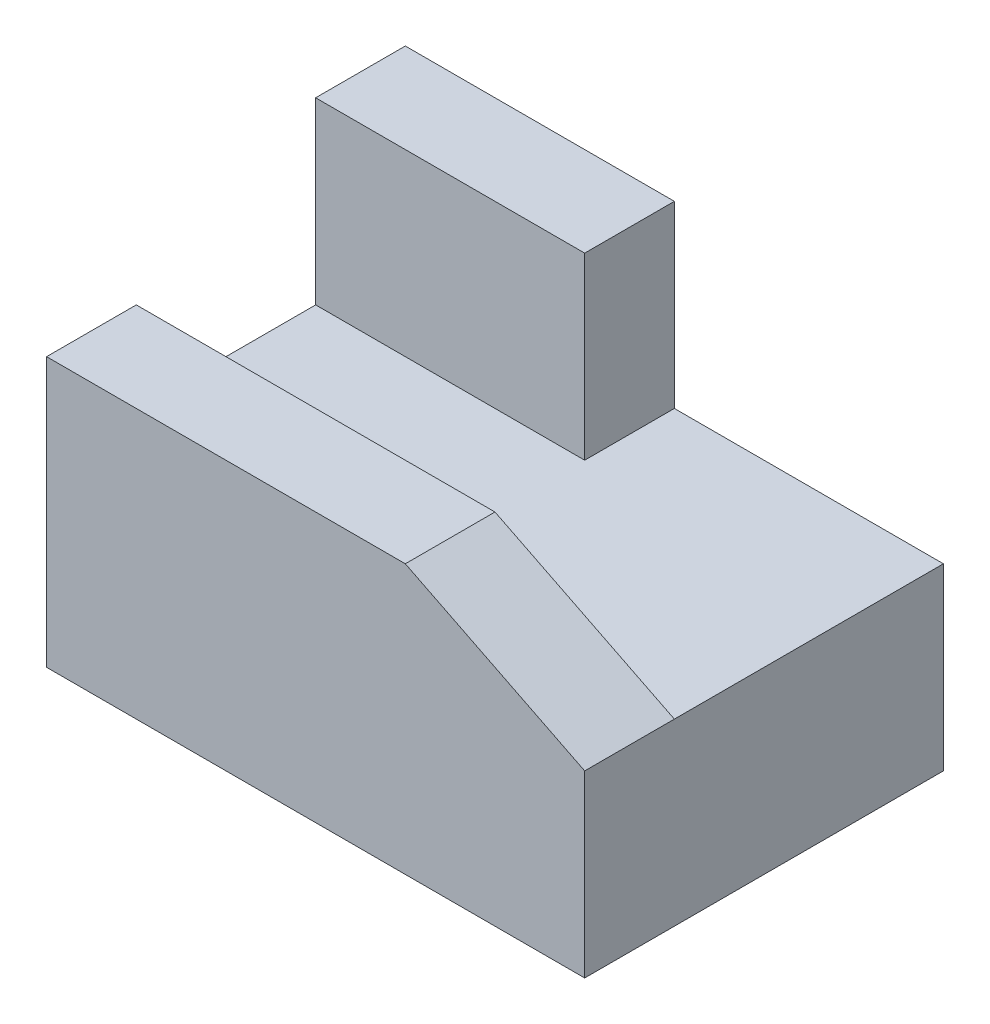
ISO-10303-21;
HEADER;
FILE_DESCRIPTION(('STEP AP214'),'2;1');
FILE_NAME('part.step','',(''),(''),'','','');
FILE_SCHEMA(('AUTOMOTIVE_DESIGN { 1 0 10303 214 1 1 1 1 }'));
ENDSEC;
DATA;
#1=APPLICATION_CONTEXT('core data for automotive mechanical design processes');
#2=APPLICATION_PROTOCOL_DEFINITION('international standard','automotive_design',2000,#1);
#3=PRODUCT_CONTEXT('',#1,'mechanical');
#4=PRODUCT('Part','Part','',(#3));
#5=PRODUCT_RELATED_PRODUCT_CATEGORY('part','',(#4));
#6=PRODUCT_DEFINITION_FORMATION('','',#4);
#7=PRODUCT_DEFINITION_CONTEXT('part definition',#1,'design');
#8=PRODUCT_DEFINITION('design','',#6,#7);
#9=PRODUCT_DEFINITION_SHAPE('','',#8);
#10=(LENGTH_UNIT() NAMED_UNIT(*) SI_UNIT(.MILLI.,.METRE.));
#11=(NAMED_UNIT(*) PLANE_ANGLE_UNIT() SI_UNIT($,.RADIAN.));
#12=(NAMED_UNIT(*) SI_UNIT($,.STERADIAN.) SOLID_ANGLE_UNIT());
#13=UNCERTAINTY_MEASURE_WITH_UNIT(LENGTH_MEASURE(1.E-05),#10,'distance_accuracy_value','');
#14=(GEOMETRIC_REPRESENTATION_CONTEXT(3) GLOBAL_UNCERTAINTY_ASSIGNED_CONTEXT((#13)) GLOBAL_UNIT_ASSIGNED_CONTEXT((#10,
#11,#12)) REPRESENTATION_CONTEXT('',''));
#15=CARTESIAN_POINT('',(0.,0.,0.));
#16=DIRECTION('',(0.,0.,1.));
#17=DIRECTION('',(1.,0.,0.));
#18=AXIS2_PLACEMENT_3D('',#15,#16,#17);
#19=CARTESIAN_POINT('',(0.,0.,40.));
#20=DIRECTION('',(-1.,0.,0.));
#21=DIRECTION('',(0.,-1.,0.));
#22=AXIS2_PLACEMENT_3D('',#19,#20,#21);
#23=PLANE('',#22);
#24=DIRECTION('',(0.,0.,-1.));
#25=VECTOR('',#24,1.);
#26=CARTESIAN_POINT('',(0.,-20.,193.077640640442));
#27=LINE('',#26,#25);
#28=CARTESIAN_POINT('',(0.,-20.,40.));
#29=VERTEX_POINT('',#28);
#30=CARTESIAN_POINT('',(0.,-20.,30.));
#31=VERTEX_POINT('',#30);
#32=EDGE_CURVE('E154',#29,#31,#27,.T.);
#33=ORIENTED_EDGE('',*,*,#32,.F.);
#34=DIRECTION('',(0.,1.,0.));
#35=VECTOR('',#34,1.);
#36=CARTESIAN_POINT('',(0.,0.,40.));
#37=LINE('',#36,#35);
#38=CARTESIAN_POINT('',(0.,-40.,40.));
#39=VERTEX_POINT('',#38);
#40=EDGE_CURVE('E81',#39,#29,#37,.T.);
#41=ORIENTED_EDGE('',*,*,#40,.F.);
#42=DIRECTION('',(0.,0.,-1.));
#43=VECTOR('',#42,1.);
#44=CARTESIAN_POINT('',(0.,-40.,40.));
#45=LINE('',#44,#43);
#46=CARTESIAN_POINT('',(0.,-40.,0.));
#47=VERTEX_POINT('',#46);
#48=EDGE_CURVE('E74',#39,#47,#45,.T.);
#49=ORIENTED_EDGE('',*,*,#48,.T.);
#50=DIRECTION('',(0.,1.,0.));
#51=VECTOR('',#50,1.);
#52=CARTESIAN_POINT('',(0.,0.,0.));
#53=LINE('',#52,#51);
#54=CARTESIAN_POINT('',(0.,-20.,0.));
#55=VERTEX_POINT('',#54);
#56=EDGE_CURVE('E89',#47,#55,#53,.T.);
#57=ORIENTED_EDGE('',*,*,#56,.T.);
#58=DIRECTION('',(0.,0.,-1.));
#59=VECTOR('',#58,1.);
#60=CARTESIAN_POINT('',(0.,-20.,30.));
#61=LINE('',#60,#59);
#62=EDGE_CURVE('E130',#31,#55,#61,.T.);
#63=ORIENTED_EDGE('',*,*,#62,.F.);
#64=EDGE_LOOP('',(#33,#41,#49,#57,#63));
#65=FACE_BOUND('',#64,.T.);
#66=ADVANCED_FACE('F33',(#65),#23,.F.);
#67=CARTESIAN_POINT('',(0.,0.,40.));
#68=DIRECTION('',(0.,-1.,0.));
#69=DIRECTION('',(0.,0.,-1.));
#70=AXIS2_PLACEMENT_3D('',#67,#68,#69);
#71=PLANE('',#70);
#72=DIRECTION('',(0.,0.,-1.));
#73=VECTOR('',#72,1.);
#74=CARTESIAN_POINT('',(-60.,0.,40.));
#75=LINE('',#74,#73);
#76=CARTESIAN_POINT('',(-60.,0.,10.));
#77=VERTEX_POINT('',#76);
#78=CARTESIAN_POINT('',(-60.,0.,0.));
#79=VERTEX_POINT('',#78);
#80=EDGE_CURVE('E109',#77,#79,#75,.T.);
#81=ORIENTED_EDGE('',*,*,#80,.F.);
#82=DIRECTION('',(-1.,0.,0.));
#83=VECTOR('',#82,1.);
#84=CARTESIAN_POINT('',(-30.,0.,10.));
#85=LINE('',#84,#83);
#86=CARTESIAN_POINT('',(-30.,0.,10.));
#87=VERTEX_POINT('',#86);
#88=EDGE_CURVE('E131',#87,#77,#85,.T.);
#89=ORIENTED_EDGE('',*,*,#88,.F.);
#90=DIRECTION('',(0.,0.,-1.));
#91=VECTOR('',#90,1.);
#92=CARTESIAN_POINT('',(-30.,0.,193.077640640442));
#93=LINE('',#92,#91);
#94=CARTESIAN_POINT('',(-30.,0.,0.));
#95=VERTEX_POINT('',#94);
#96=EDGE_CURVE('E157',#87,#95,#93,.T.);
#97=ORIENTED_EDGE('',*,*,#96,.T.);
#98=DIRECTION('',(-1.,0.,0.));
#99=VECTOR('',#98,1.);
#100=CARTESIAN_POINT('',(0.,0.,0.));
#101=LINE('',#100,#99);
#102=EDGE_CURVE('E96',#95,#79,#101,.T.);
#103=ORIENTED_EDGE('',*,*,#102,.T.);
#104=EDGE_LOOP('',(#81,#89,#97,#103));
#105=FACE_BOUND('',#104,.T.);
#106=ADVANCED_FACE('F179',(#105),#71,.F.);
#107=CARTESIAN_POINT('',(0.,0.,40.));
#108=DIRECTION('',(0.,0.,-1.));
#109=DIRECTION('',(-1.,0.,0.));
#110=AXIS2_PLACEMENT_3D('',#107,#108,#109);
#111=PLANE('',#110);
#112=DIRECTION('',(1.,0.,0.));
#113=VECTOR('',#112,1.);
#114=CARTESIAN_POINT('',(0.,-9.99999999999999,40.));
#115=LINE('',#114,#113);
#116=CARTESIAN_POINT('',(-60.,-10.,40.));
#117=VERTEX_POINT('',#116);
#118=CARTESIAN_POINT('',(-20.,-10.,40.));
#119=VERTEX_POINT('',#118);
#120=EDGE_CURVE('E97',#117,#119,#115,.T.);
#121=ORIENTED_EDGE('',*,*,#120,.F.);
#122=DIRECTION('',(0.,-1.,0.));
#123=VECTOR('',#122,1.);
#124=CARTESIAN_POINT('',(-60.,0.,40.));
#125=LINE('',#124,#123);
#126=CARTESIAN_POINT('',(-60.,-40.,40.));
#127=VERTEX_POINT('',#126);
#128=EDGE_CURVE('E164',#117,#127,#125,.T.);
#129=ORIENTED_EDGE('',*,*,#128,.T.);
#130=DIRECTION('',(1.,0.,0.));
#131=VECTOR('',#130,1.);
#132=CARTESIAN_POINT('',(0.,-40.,40.));
#133=LINE('',#132,#131);
#134=EDGE_CURVE('E55',#127,#39,#133,.T.);
#135=ORIENTED_EDGE('',*,*,#134,.T.);
#136=ORIENTED_EDGE('',*,*,#40,.T.);
#137=DIRECTION('',(0.894427190999916,-0.447213595499958,0.));
#138=VECTOR('',#137,1.);
#139=CARTESIAN_POINT('',(-8.00000000000001,-16.,40.));
#140=LINE('',#139,#138);
#141=EDGE_CURVE('E102',#119,#29,#140,.T.);
#142=ORIENTED_EDGE('',*,*,#141,.F.);
#143=EDGE_LOOP('',(#121,#129,#135,#136,#142));
#144=FACE_BOUND('',#143,.T.);
#145=ADVANCED_FACE('F167',(#144),#111,.F.);
#146=CARTESIAN_POINT('',(0.,0.,0.));
#147=DIRECTION('',(0.,0.,-1.));
#148=DIRECTION('',(-1.,0.,0.));
#149=AXIS2_PLACEMENT_3D('',#146,#147,#148);
#150=PLANE('',#149);
#151=DIRECTION('',(0.,-1.,0.));
#152=VECTOR('',#151,1.);
#153=CARTESIAN_POINT('',(-30.,0.,0.));
#154=LINE('',#153,#152);
#155=CARTESIAN_POINT('',(-30.,-20.,0.));
#156=VERTEX_POINT('',#155);
#157=EDGE_CURVE('E40',#95,#156,#154,.T.);
#158=ORIENTED_EDGE('',*,*,#157,.T.);
#159=DIRECTION('',(-1.,0.,0.));
#160=VECTOR('',#159,1.);
#161=CARTESIAN_POINT('',(0.,-20.,0.));
#162=LINE('',#161,#160);
#163=EDGE_CURVE('E95',#55,#156,#162,.T.);
#164=ORIENTED_EDGE('',*,*,#163,.F.);
#165=ORIENTED_EDGE('',*,*,#56,.F.);
#166=DIRECTION('',(1.,0.,0.));
#167=VECTOR('',#166,1.);
#168=CARTESIAN_POINT('',(0.,-40.,0.));
#169=LINE('',#168,#167);
#170=CARTESIAN_POINT('',(-60.,-40.,0.));
#171=VERTEX_POINT('',#170);
#172=EDGE_CURVE('E71',#171,#47,#169,.T.);
#173=ORIENTED_EDGE('',*,*,#172,.F.);
#174=DIRECTION('',(0.,-1.,0.));
#175=VECTOR('',#174,1.);
#176=CARTESIAN_POINT('',(-60.,0.,0.));
#177=LINE('',#176,#175);
#178=EDGE_CURVE('E82',#79,#171,#177,.T.);
#179=ORIENTED_EDGE('',*,*,#178,.F.);
#180=ORIENTED_EDGE('',*,*,#102,.F.);
#181=EDGE_LOOP('',(#158,#164,#165,#173,#179,#180));
#182=FACE_BOUND('',#181,.T.);
#183=ADVANCED_FACE('F93',(#182),#150,.T.);
#184=CARTESIAN_POINT('',(-60.,0.,40.));
#185=DIRECTION('',(1.,0.,0.));
#186=DIRECTION('',(0.,1.,0.));
#187=AXIS2_PLACEMENT_3D('',#184,#185,#186);
#188=PLANE('',#187);
#189=ORIENTED_EDGE('',*,*,#128,.F.);
#190=DIRECTION('',(0.,0.,-1.));
#191=VECTOR('',#190,1.);
#192=CARTESIAN_POINT('',(-60.,-10.,40.));
#193=LINE('',#192,#191);
#194=CARTESIAN_POINT('',(-60.,-10.,30.));
#195=VERTEX_POINT('',#194);
#196=EDGE_CURVE('E134',#117,#195,#193,.T.);
#197=ORIENTED_EDGE('',*,*,#196,.T.);
#198=DIRECTION('',(0.,1.,0.));
#199=VECTOR('',#198,1.);
#200=CARTESIAN_POINT('',(-60.,-20.,30.));
#201=LINE('',#200,#199);
#202=CARTESIAN_POINT('',(-60.,-20.,30.));
#203=VERTEX_POINT('',#202);
#204=EDGE_CURVE('E143',#203,#195,#201,.T.);
#205=ORIENTED_EDGE('',*,*,#204,.F.);
#206=DIRECTION('',(0.,0.,1.));
#207=VECTOR('',#206,1.);
#208=CARTESIAN_POINT('',(-60.,-20.,10.));
#209=LINE('',#208,#207);
#210=CARTESIAN_POINT('',(-60.,-20.,10.));
#211=VERTEX_POINT('',#210);
#212=EDGE_CURVE('E139',#211,#203,#209,.T.);
#213=ORIENTED_EDGE('',*,*,#212,.F.);
#214=DIRECTION('',(0.,1.,0.));
#215=VECTOR('',#214,1.);
#216=CARTESIAN_POINT('',(-60.,-20.,10.));
#217=LINE('',#216,#215);
#218=EDGE_CURVE('E147',#211,#77,#217,.T.);
#219=ORIENTED_EDGE('',*,*,#218,.T.);
#220=ORIENTED_EDGE('',*,*,#80,.T.);
#221=ORIENTED_EDGE('',*,*,#178,.T.);
#222=DIRECTION('',(0.,0.,-1.));
#223=VECTOR('',#222,1.);
#224=CARTESIAN_POINT('',(-60.,-40.,40.));
#225=LINE('',#224,#223);
#226=EDGE_CURVE('E77',#127,#171,#225,.T.);
#227=ORIENTED_EDGE('',*,*,#226,.F.);
#228=EDGE_LOOP('',(#189,#197,#205,#213,#219,#220,#221,#227));
#229=FACE_BOUND('',#228,.T.);
#230=ADVANCED_FACE('F173',(#229),#188,.F.);
#231=CARTESIAN_POINT('',(0.,-40.,40.));
#232=DIRECTION('',(0.,1.,0.));
#233=DIRECTION('',(-1.,0.,0.));
#234=AXIS2_PLACEMENT_3D('',#231,#232,#233);
#235=PLANE('',#234);
#236=ORIENTED_EDGE('',*,*,#172,.T.);
#237=ORIENTED_EDGE('',*,*,#48,.F.);
#238=ORIENTED_EDGE('',*,*,#134,.F.);
#239=ORIENTED_EDGE('',*,*,#226,.T.);
#240=EDGE_LOOP('',(#236,#237,#238,#239));
#241=FACE_BOUND('',#240,.T.);
#242=ADVANCED_FACE('F73',(#241),#235,.F.);
#243=CARTESIAN_POINT('',(-30.,0.,193.077640640442));
#244=DIRECTION('',(1.,0.,0.));
#245=DIRECTION('',(0.,1.,0.));
#246=AXIS2_PLACEMENT_3D('',#243,#244,#245);
#247=PLANE('',#246);
#248=DIRECTION('',(0.,1.,0.));
#249=VECTOR('',#248,1.);
#250=CARTESIAN_POINT('',(-30.,-20.,10.));
#251=LINE('',#250,#249);
#252=CARTESIAN_POINT('',(-30.,-20.,10.));
#253=VERTEX_POINT('',#252);
#254=EDGE_CURVE('E124',#253,#87,#251,.T.);
#255=ORIENTED_EDGE('',*,*,#254,.F.);
#256=DIRECTION('',(0.,0.,1.));
#257=VECTOR('',#256,1.);
#258=CARTESIAN_POINT('',(-30.,-20.,0.));
#259=LINE('',#258,#257);
#260=EDGE_CURVE('E121',#156,#253,#259,.T.);
#261=ORIENTED_EDGE('',*,*,#260,.F.);
#262=ORIENTED_EDGE('',*,*,#157,.F.);
#263=ORIENTED_EDGE('',*,*,#96,.F.);
#264=EDGE_LOOP('',(#255,#261,#262,#263));
#265=FACE_BOUND('',#264,.T.);
#266=ADVANCED_FACE('F122',(#265),#247,.T.);
#267=CARTESIAN_POINT('',(-30.,-10.,193.077640640442));
#268=DIRECTION('',(0.,1.,0.));
#269=DIRECTION('',(-1.,0.,0.));
#270=AXIS2_PLACEMENT_3D('',#267,#268,#269);
#271=PLANE('',#270);
#272=DIRECTION('',(1.,0.,0.));
#273=VECTOR('',#272,1.);
#274=CARTESIAN_POINT('',(-30.,-10.,30.));
#275=LINE('',#274,#273);
#276=CARTESIAN_POINT('',(-20.,-10.,30.));
#277=VERTEX_POINT('',#276);
#278=EDGE_CURVE('E146',#195,#277,#275,.T.);
#279=ORIENTED_EDGE('',*,*,#278,.F.);
#280=ORIENTED_EDGE('',*,*,#196,.F.);
#281=ORIENTED_EDGE('',*,*,#120,.T.);
#282=DIRECTION('',(0.,0.,-1.));
#283=VECTOR('',#282,1.);
#284=CARTESIAN_POINT('',(-20.,-10.,193.077640640442));
#285=LINE('',#284,#283);
#286=EDGE_CURVE('E153',#119,#277,#285,.T.);
#287=ORIENTED_EDGE('',*,*,#286,.T.);
#288=EDGE_LOOP('',(#279,#280,#281,#287));
#289=FACE_BOUND('',#288,.T.);
#290=ADVANCED_FACE('F200',(#289),#271,.T.);
#291=CARTESIAN_POINT('',(-20.,-10.,193.077640640442));
#292=DIRECTION('',(0.447213595499958,0.894427190999916,0.));
#293=DIRECTION('',(-0.894427190999916,0.447213595499958,0.));
#294=AXIS2_PLACEMENT_3D('',#291,#292,#293);
#295=PLANE('',#294);
#296=DIRECTION('',(0.894427190999916,-0.447213595499958,0.));
#297=VECTOR('',#296,1.);
#298=CARTESIAN_POINT('',(-20.,-10.,30.));
#299=LINE('',#298,#297);
#300=EDGE_CURVE('E11',#277,#31,#299,.T.);
#301=ORIENTED_EDGE('',*,*,#300,.F.);
#302=ORIENTED_EDGE('',*,*,#286,.F.);
#303=ORIENTED_EDGE('',*,*,#141,.T.);
#304=ORIENTED_EDGE('',*,*,#32,.T.);
#305=EDGE_LOOP('',(#301,#302,#303,#304));
#306=FACE_BOUND('',#305,.T.);
#307=ADVANCED_FACE('F198',(#306),#295,.T.);
#308=CARTESIAN_POINT('',(-60.,-20.,30.));
#309=DIRECTION('',(0.,0.,1.));
#310=DIRECTION('',(1.,0.,0.));
#311=AXIS2_PLACEMENT_3D('',#308,#309,#310);
#312=PLANE('',#311);
#313=ORIENTED_EDGE('',*,*,#204,.T.);
#314=ORIENTED_EDGE('',*,*,#278,.T.);
#315=ORIENTED_EDGE('',*,*,#300,.T.);
#316=DIRECTION('',(1.,0.,0.));
#317=VECTOR('',#316,1.);
#318=CARTESIAN_POINT('',(-60.,-20.,30.));
#319=LINE('',#318,#317);
#320=EDGE_CURVE('E47',#203,#31,#319,.T.);
#321=ORIENTED_EDGE('',*,*,#320,.F.);
#322=EDGE_LOOP('',(#313,#314,#315,#321));
#323=FACE_BOUND('',#322,.T.);
#324=ADVANCED_FACE('F205',(#323),#312,.F.);
#325=CARTESIAN_POINT('',(-30.,-20.,10.));
#326=DIRECTION('',(0.,0.,-1.));
#327=DIRECTION('',(-1.,0.,0.));
#328=AXIS2_PLACEMENT_3D('',#325,#326,#327);
#329=PLANE('',#328);
#330=ORIENTED_EDGE('',*,*,#88,.T.);
#331=ORIENTED_EDGE('',*,*,#218,.F.);
#332=DIRECTION('',(-1.,0.,0.));
#333=VECTOR('',#332,1.);
#334=CARTESIAN_POINT('',(-30.,-20.,10.));
#335=LINE('',#334,#333);
#336=EDGE_CURVE('E127',#253,#211,#335,.T.);
#337=ORIENTED_EDGE('',*,*,#336,.F.);
#338=ORIENTED_EDGE('',*,*,#254,.T.);
#339=EDGE_LOOP('',(#330,#331,#337,#338));
#340=FACE_BOUND('',#339,.T.);
#341=ADVANCED_FACE('F209',(#340),#329,.F.);
#342=CARTESIAN_POINT('',(0.,-20.,0.));
#343=DIRECTION('',(0.,1.,0.));
#344=DIRECTION('',(0.,0.,1.));
#345=AXIS2_PLACEMENT_3D('',#342,#343,#344);
#346=PLANE('',#345);
#347=ORIENTED_EDGE('',*,*,#163,.T.);
#348=ORIENTED_EDGE('',*,*,#260,.T.);
#349=ORIENTED_EDGE('',*,*,#336,.T.);
#350=ORIENTED_EDGE('',*,*,#212,.T.);
#351=ORIENTED_EDGE('',*,*,#320,.T.);
#352=ORIENTED_EDGE('',*,*,#62,.T.);
#353=EDGE_LOOP('',(#347,#348,#349,#350,#351,#352));
#354=FACE_BOUND('',#353,.T.);
#355=ADVANCED_FACE('F129',(#354),#346,.T.);
#356=CLOSED_SHELL('',(#66,#106,#145,#183,#230,#242,#266,#290,#307,#324,#341,#355));
#357=MANIFOLD_SOLID_BREP('B2',#356);
#358=ADVANCED_BREP_SHAPE_REPRESENTATION('',(#18,#357),#14);
#359=SHAPE_DEFINITION_REPRESENTATION(#9,#358);
ENDSEC;
END-ISO-10303-21;
